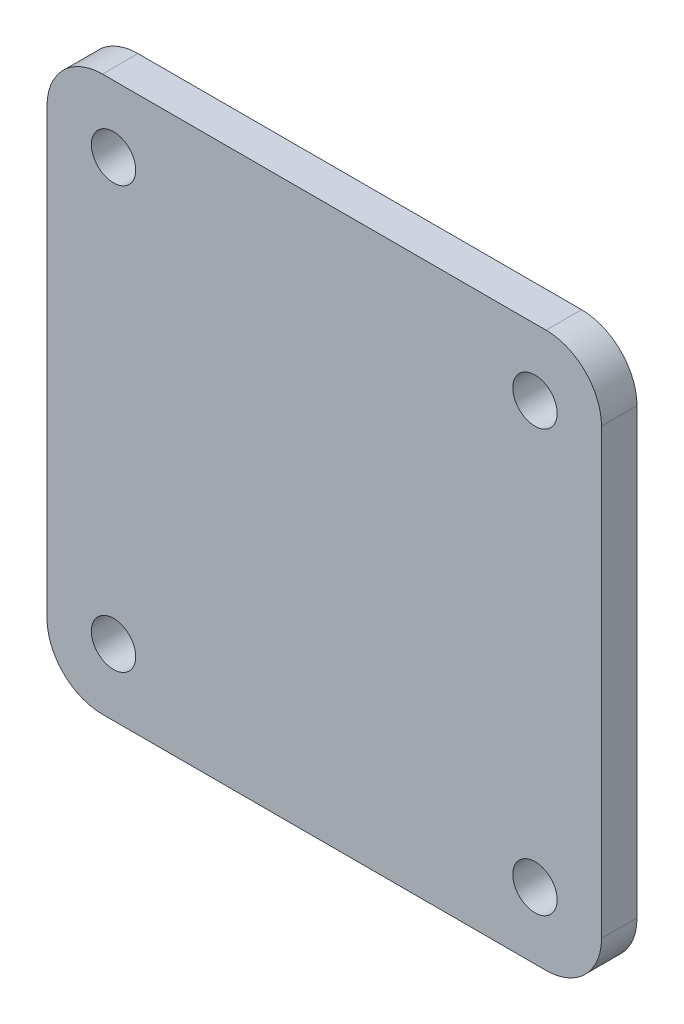
ISO-10303-21;
HEADER;
FILE_DESCRIPTION(('STEP AP214'),'2;1');
FILE_NAME('part.step','',(''),(''),'','','');
FILE_SCHEMA(('AUTOMOTIVE_DESIGN { 1 0 10303 214 1 1 1 1 }'));
ENDSEC;
DATA;
#1=APPLICATION_CONTEXT('core data for automotive mechanical design processes');
#2=APPLICATION_PROTOCOL_DEFINITION('international standard','automotive_design',2000,#1);
#3=PRODUCT_CONTEXT('',#1,'mechanical');
#4=PRODUCT('Part','Part','',(#3));
#5=PRODUCT_RELATED_PRODUCT_CATEGORY('part','',(#4));
#6=PRODUCT_DEFINITION_FORMATION('','',#4);
#7=PRODUCT_DEFINITION_CONTEXT('part definition',#1,'design');
#8=PRODUCT_DEFINITION('design','',#6,#7);
#9=PRODUCT_DEFINITION_SHAPE('','',#8);
#10=(LENGTH_UNIT() NAMED_UNIT(*) SI_UNIT(.MILLI.,.METRE.));
#11=(NAMED_UNIT(*) PLANE_ANGLE_UNIT() SI_UNIT($,.RADIAN.));
#12=(NAMED_UNIT(*) SI_UNIT($,.STERADIAN.) SOLID_ANGLE_UNIT());
#13=UNCERTAINTY_MEASURE_WITH_UNIT(LENGTH_MEASURE(1.E-05),#10,'distance_accuracy_value','');
#14=(GEOMETRIC_REPRESENTATION_CONTEXT(3) GLOBAL_UNCERTAINTY_ASSIGNED_CONTEXT((#13)) GLOBAL_UNIT_ASSIGNED_CONTEXT((#10,
#11,#12)) REPRESENTATION_CONTEXT('',''));
#15=CARTESIAN_POINT('',(0.,0.,0.));
#16=DIRECTION('',(0.,0.,1.));
#17=DIRECTION('',(1.,0.,0.));
#18=AXIS2_PLACEMENT_3D('',#15,#16,#17);
#19=CARTESIAN_POINT('',(0.,0.,1.6));
#20=DIRECTION('',(0.,0.,1.));
#21=DIRECTION('',(1.,0.,0.));
#22=AXIS2_PLACEMENT_3D('',#19,#20,#21);
#23=PLANE('',#22);
#24=CARTESIAN_POINT('',(9.50000000000001,-9.5,1.6));
#25=DIRECTION('',(0.,0.,1.));
#26=DIRECTION('',(1.,0.,0.));
#27=AXIS2_PLACEMENT_3D('',#24,#25,#26);
#28=CIRCLE('',#27,1.);
#29=CARTESIAN_POINT('',(10.5,-9.5,1.6));
#30=VERTEX_POINT('',#29);
#31=EDGE_CURVE('E189',#30,#30,#28,.T.);
#32=ORIENTED_EDGE('',*,*,#31,.F.);
#33=EDGE_LOOP('',(#32));
#34=FACE_BOUND('',#33,.T.);
#35=CARTESIAN_POINT('',(-9.50000000000001,9.5,1.6));
#36=DIRECTION('',(0.,0.,1.));
#37=DIRECTION('',(1.,0.,0.));
#38=AXIS2_PLACEMENT_3D('',#35,#36,#37);
#39=CIRCLE('',#38,1.);
#40=CARTESIAN_POINT('',(-8.5,9.5,1.6));
#41=VERTEX_POINT('',#40);
#42=EDGE_CURVE('E175',#41,#41,#39,.T.);
#43=ORIENTED_EDGE('',*,*,#42,.F.);
#44=EDGE_LOOP('',(#43));
#45=FACE_BOUND('',#44,.T.);
#46=DIRECTION('',(-1.,0.,0.));
#47=VECTOR('',#46,1.);
#48=CARTESIAN_POINT('',(-12.5,12.5,1.6));
#49=LINE('',#48,#47);
#50=CARTESIAN_POINT('',(10.,12.5,1.6));
#51=VERTEX_POINT('',#50);
#52=CARTESIAN_POINT('',(-10.,12.5,1.6));
#53=VERTEX_POINT('',#52);
#54=EDGE_CURVE('E170',#51,#53,#49,.T.);
#55=ORIENTED_EDGE('',*,*,#54,.T.);
#56=CARTESIAN_POINT('',(-10.,10.,1.6));
#57=DIRECTION('',(0.,0.,1.));
#58=DIRECTION('',(1.,0.,0.));
#59=AXIS2_PLACEMENT_3D('',#56,#57,#58);
#60=CIRCLE('',#59,2.5);
#61=CARTESIAN_POINT('',(-12.5,10.,1.6));
#62=VERTEX_POINT('',#61);
#63=EDGE_CURVE('E151',#53,#62,#60,.T.);
#64=ORIENTED_EDGE('',*,*,#63,.T.);
#65=DIRECTION('',(0.,-1.,0.));
#66=VECTOR('',#65,1.);
#67=CARTESIAN_POINT('',(-12.5,12.5,1.6));
#68=LINE('',#67,#66);
#69=CARTESIAN_POINT('',(-12.5,-10.,1.6));
#70=VERTEX_POINT('',#69);
#71=EDGE_CURVE('E121',#62,#70,#68,.T.);
#72=ORIENTED_EDGE('',*,*,#71,.T.);
#73=CARTESIAN_POINT('',(-10.,-10.,1.6));
#74=DIRECTION('',(0.,0.,1.));
#75=DIRECTION('',(1.,0.,0.));
#76=AXIS2_PLACEMENT_3D('',#73,#74,#75);
#77=CIRCLE('',#76,2.5);
#78=CARTESIAN_POINT('',(-10.,-12.5,1.6));
#79=VERTEX_POINT('',#78);
#80=EDGE_CURVE('E57',#70,#79,#77,.T.);
#81=ORIENTED_EDGE('',*,*,#80,.T.);
#82=DIRECTION('',(1.,0.,0.));
#83=VECTOR('',#82,1.);
#84=CARTESIAN_POINT('',(-12.5,-12.5,1.6));
#85=LINE('',#84,#83);
#86=CARTESIAN_POINT('',(10.,-12.5,1.6));
#87=VERTEX_POINT('',#86);
#88=EDGE_CURVE('E137',#79,#87,#85,.T.);
#89=ORIENTED_EDGE('',*,*,#88,.T.);
#90=CARTESIAN_POINT('',(10.,-10.,1.6));
#91=DIRECTION('',(0.,0.,1.));
#92=DIRECTION('',(1.,0.,0.));
#93=AXIS2_PLACEMENT_3D('',#90,#91,#92);
#94=CIRCLE('',#93,2.5);
#95=CARTESIAN_POINT('',(12.5,-10.,1.6));
#96=VERTEX_POINT('',#95);
#97=EDGE_CURVE('E148',#87,#96,#94,.T.);
#98=ORIENTED_EDGE('',*,*,#97,.T.);
#99=DIRECTION('',(0.,1.,0.));
#100=VECTOR('',#99,1.);
#101=CARTESIAN_POINT('',(12.5,12.5,1.6));
#102=LINE('',#101,#100);
#103=CARTESIAN_POINT('',(12.5,10.,1.6));
#104=VERTEX_POINT('',#103);
#105=EDGE_CURVE('E131',#96,#104,#102,.T.);
#106=ORIENTED_EDGE('',*,*,#105,.T.);
#107=CARTESIAN_POINT('',(10.,10.,1.6));
#108=DIRECTION('',(0.,0.,1.));
#109=DIRECTION('',(1.,0.,0.));
#110=AXIS2_PLACEMENT_3D('',#107,#108,#109);
#111=CIRCLE('',#110,2.5);
#112=EDGE_CURVE('E146',#104,#51,#111,.T.);
#113=ORIENTED_EDGE('',*,*,#112,.T.);
#114=EDGE_LOOP('',(#55,#64,#72,#81,#89,#98,#106,#113));
#115=FACE_BOUND('',#114,.T.);
#116=CARTESIAN_POINT('',(9.50000000000001,9.5,1.6));
#117=DIRECTION('',(0.,0.,1.));
#118=DIRECTION('',(-1.,0.,0.));
#119=AXIS2_PLACEMENT_3D('',#116,#117,#118);
#120=CIRCLE('',#119,1.);
#121=CARTESIAN_POINT('',(8.5,9.5,1.6));
#122=VERTEX_POINT('',#121);
#123=EDGE_CURVE('E184',#122,#122,#120,.T.);
#124=ORIENTED_EDGE('',*,*,#123,.F.);
#125=EDGE_LOOP('',(#124));
#126=FACE_BOUND('',#125,.T.);
#127=CARTESIAN_POINT('',(-9.50000000000001,-9.5,1.6));
#128=DIRECTION('',(0.,0.,1.));
#129=DIRECTION('',(-1.,0.,0.));
#130=AXIS2_PLACEMENT_3D('',#127,#128,#129);
#131=CIRCLE('',#130,1.);
#132=CARTESIAN_POINT('',(-10.5,-9.5,1.6));
#133=VERTEX_POINT('',#132);
#134=EDGE_CURVE('E195',#133,#133,#131,.T.);
#135=ORIENTED_EDGE('',*,*,#134,.F.);
#136=EDGE_LOOP('',(#135));
#137=FACE_BOUND('',#136,.T.);
#138=ADVANCED_FACE('F35',(#34,#45,#115,#126,#137),#23,.T.);
#139=CARTESIAN_POINT('',(0.,0.,0.));
#140=DIRECTION('',(0.,0.,1.));
#141=DIRECTION('',(1.,0.,0.));
#142=AXIS2_PLACEMENT_3D('',#139,#140,#141);
#143=PLANE('',#142);
#144=DIRECTION('',(0.,-1.,0.));
#145=VECTOR('',#144,1.);
#146=CARTESIAN_POINT('',(-12.5,12.5,0.));
#147=LINE('',#146,#145);
#148=CARTESIAN_POINT('',(-12.5,10.,0.));
#149=VERTEX_POINT('',#148);
#150=CARTESIAN_POINT('',(-12.5,-10.,0.));
#151=VERTEX_POINT('',#150);
#152=EDGE_CURVE('E119',#149,#151,#147,.T.);
#153=ORIENTED_EDGE('',*,*,#152,.F.);
#154=CARTESIAN_POINT('',(-10.,10.,0.));
#155=DIRECTION('',(0.,0.,1.));
#156=DIRECTION('',(1.,0.,0.));
#157=AXIS2_PLACEMENT_3D('',#154,#155,#156);
#158=CIRCLE('',#157,2.5);
#159=CARTESIAN_POINT('',(-10.,12.5,0.));
#160=VERTEX_POINT('',#159);
#161=EDGE_CURVE('E102',#149,#160,#158,.F.);
#162=ORIENTED_EDGE('',*,*,#161,.T.);
#163=DIRECTION('',(-1.,0.,0.));
#164=VECTOR('',#163,1.);
#165=CARTESIAN_POINT('',(-12.5,12.5,0.));
#166=LINE('',#165,#164);
#167=CARTESIAN_POINT('',(10.,12.5,0.));
#168=VERTEX_POINT('',#167);
#169=EDGE_CURVE('E129',#168,#160,#166,.T.);
#170=ORIENTED_EDGE('',*,*,#169,.F.);
#171=CARTESIAN_POINT('',(10.,10.,0.));
#172=DIRECTION('',(0.,0.,1.));
#173=DIRECTION('',(1.,0.,0.));
#174=AXIS2_PLACEMENT_3D('',#171,#172,#173);
#175=CIRCLE('',#174,2.5);
#176=CARTESIAN_POINT('',(12.5,10.,0.));
#177=VERTEX_POINT('',#176);
#178=EDGE_CURVE('E122',#168,#177,#175,.F.);
#179=ORIENTED_EDGE('',*,*,#178,.T.);
#180=DIRECTION('',(0.,1.,0.));
#181=VECTOR('',#180,1.);
#182=CARTESIAN_POINT('',(12.5,12.5,0.));
#183=LINE('',#182,#181);
#184=CARTESIAN_POINT('',(12.5,-10.,0.));
#185=VERTEX_POINT('',#184);
#186=EDGE_CURVE('E133',#185,#177,#183,.T.);
#187=ORIENTED_EDGE('',*,*,#186,.F.);
#188=CARTESIAN_POINT('',(10.,-10.,0.));
#189=DIRECTION('',(0.,0.,1.));
#190=DIRECTION('',(1.,0.,0.));
#191=AXIS2_PLACEMENT_3D('',#188,#189,#190);
#192=CIRCLE('',#191,2.5);
#193=CARTESIAN_POINT('',(10.,-12.5,0.));
#194=VERTEX_POINT('',#193);
#195=EDGE_CURVE('E140',#185,#194,#192,.F.);
#196=ORIENTED_EDGE('',*,*,#195,.T.);
#197=DIRECTION('',(1.,0.,0.));
#198=VECTOR('',#197,1.);
#199=CARTESIAN_POINT('',(-12.5,-12.5,0.));
#200=LINE('',#199,#198);
#201=CARTESIAN_POINT('',(-10.,-12.5,0.));
#202=VERTEX_POINT('',#201);
#203=EDGE_CURVE('E128',#202,#194,#200,.T.);
#204=ORIENTED_EDGE('',*,*,#203,.F.);
#205=CARTESIAN_POINT('',(-10.,-10.,0.));
#206=DIRECTION('',(0.,0.,1.));
#207=DIRECTION('',(1.,0.,0.));
#208=AXIS2_PLACEMENT_3D('',#205,#206,#207);
#209=CIRCLE('',#208,2.5);
#210=EDGE_CURVE('E113',#202,#151,#209,.F.);
#211=ORIENTED_EDGE('',*,*,#210,.T.);
#212=EDGE_LOOP('',(#153,#162,#170,#179,#187,#196,#204,#211));
#213=FACE_BOUND('',#212,.T.);
#214=CARTESIAN_POINT('',(-9.50000000000001,9.5,0.));
#215=DIRECTION('',(0.,0.,1.));
#216=DIRECTION('',(1.,0.,0.));
#217=AXIS2_PLACEMENT_3D('',#214,#215,#216);
#218=CIRCLE('',#217,1.);
#219=CARTESIAN_POINT('',(-8.5,9.5,0.));
#220=VERTEX_POINT('',#219);
#221=EDGE_CURVE('E177',#220,#220,#218,.T.);
#222=ORIENTED_EDGE('',*,*,#221,.T.);
#223=EDGE_LOOP('',(#222));
#224=FACE_BOUND('',#223,.T.);
#225=CARTESIAN_POINT('',(9.50000000000001,9.5,0.));
#226=DIRECTION('',(0.,0.,1.));
#227=DIRECTION('',(-1.,0.,0.));
#228=AXIS2_PLACEMENT_3D('',#225,#226,#227);
#229=CIRCLE('',#228,1.);
#230=CARTESIAN_POINT('',(8.5,9.5,0.));
#231=VERTEX_POINT('',#230);
#232=EDGE_CURVE('E186',#231,#231,#229,.T.);
#233=ORIENTED_EDGE('',*,*,#232,.T.);
#234=EDGE_LOOP('',(#233));
#235=FACE_BOUND('',#234,.T.);
#236=CARTESIAN_POINT('',(9.50000000000001,-9.5,0.));
#237=DIRECTION('',(0.,0.,1.));
#238=DIRECTION('',(1.,0.,0.));
#239=AXIS2_PLACEMENT_3D('',#236,#237,#238);
#240=CIRCLE('',#239,1.);
#241=CARTESIAN_POINT('',(10.5,-9.5,0.));
#242=VERTEX_POINT('',#241);
#243=EDGE_CURVE('E192',#242,#242,#240,.T.);
#244=ORIENTED_EDGE('',*,*,#243,.T.);
#245=EDGE_LOOP('',(#244));
#246=FACE_BOUND('',#245,.T.);
#247=CARTESIAN_POINT('',(-9.50000000000001,-9.5,0.));
#248=DIRECTION('',(0.,0.,1.));
#249=DIRECTION('',(-1.,0.,0.));
#250=AXIS2_PLACEMENT_3D('',#247,#248,#249);
#251=CIRCLE('',#250,1.);
#252=CARTESIAN_POINT('',(-10.5,-9.5,0.));
#253=VERTEX_POINT('',#252);
#254=EDGE_CURVE('E198',#253,#253,#251,.T.);
#255=ORIENTED_EDGE('',*,*,#254,.T.);
#256=EDGE_LOOP('',(#255));
#257=FACE_BOUND('',#256,.T.);
#258=ADVANCED_FACE('F125',(#213,#224,#235,#246,#257),#143,.F.);
#259=CARTESIAN_POINT('',(12.5,12.5,1.6));
#260=DIRECTION('',(-1.,0.,0.));
#261=DIRECTION('',(0.,0.,1.));
#262=AXIS2_PLACEMENT_3D('',#259,#260,#261);
#263=PLANE('',#262);
#264=ORIENTED_EDGE('',*,*,#105,.F.);
#265=DIRECTION('',(0.,0.,-1.));
#266=VECTOR('',#265,1.);
#267=CARTESIAN_POINT('',(12.5,-10.,1.6));
#268=LINE('',#267,#266);
#269=EDGE_CURVE('E11',#96,#185,#268,.T.);
#270=ORIENTED_EDGE('',*,*,#269,.T.);
#271=ORIENTED_EDGE('',*,*,#186,.T.);
#272=DIRECTION('',(0.,0.,-1.));
#273=VECTOR('',#272,1.);
#274=CARTESIAN_POINT('',(12.5,10.,1.6));
#275=LINE('',#274,#273);
#276=EDGE_CURVE('E43',#177,#104,#275,.F.);
#277=ORIENTED_EDGE('',*,*,#276,.T.);
#278=EDGE_LOOP('',(#264,#270,#271,#277));
#279=FACE_BOUND('',#278,.T.);
#280=ADVANCED_FACE('F161',(#279),#263,.F.);
#281=CARTESIAN_POINT('',(-12.5,12.5,1.6));
#282=DIRECTION('',(0.,-1.,0.));
#283=DIRECTION('',(0.,0.,-1.));
#284=AXIS2_PLACEMENT_3D('',#281,#282,#283);
#285=PLANE('',#284);
#286=ORIENTED_EDGE('',*,*,#169,.T.);
#287=DIRECTION('',(0.,0.,-1.));
#288=VECTOR('',#287,1.);
#289=CARTESIAN_POINT('',(-10.,12.5,1.6));
#290=LINE('',#289,#288);
#291=EDGE_CURVE('E107',#160,#53,#290,.F.);
#292=ORIENTED_EDGE('',*,*,#291,.T.);
#293=ORIENTED_EDGE('',*,*,#54,.F.);
#294=DIRECTION('',(0.,0.,-1.));
#295=VECTOR('',#294,1.);
#296=CARTESIAN_POINT('',(10.,12.5,1.6));
#297=LINE('',#296,#295);
#298=EDGE_CURVE('E112',#51,#168,#297,.T.);
#299=ORIENTED_EDGE('',*,*,#298,.T.);
#300=EDGE_LOOP('',(#286,#292,#293,#299));
#301=FACE_BOUND('',#300,.T.);
#302=ADVANCED_FACE('F174',(#301),#285,.F.);
#303=CARTESIAN_POINT('',(-12.5,12.5,1.6));
#304=DIRECTION('',(1.,0.,0.));
#305=DIRECTION('',(0.,0.,-1.));
#306=AXIS2_PLACEMENT_3D('',#303,#304,#305);
#307=PLANE('',#306);
#308=ORIENTED_EDGE('',*,*,#71,.F.);
#309=DIRECTION('',(0.,0.,-1.));
#310=VECTOR('',#309,1.);
#311=CARTESIAN_POINT('',(-12.5,10.,1.6));
#312=LINE('',#311,#310);
#313=EDGE_CURVE('E106',#62,#149,#312,.T.);
#314=ORIENTED_EDGE('',*,*,#313,.T.);
#315=ORIENTED_EDGE('',*,*,#152,.T.);
#316=DIRECTION('',(0.,0.,-1.));
#317=VECTOR('',#316,1.);
#318=CARTESIAN_POINT('',(-12.5,-10.,1.6));
#319=LINE('',#318,#317);
#320=EDGE_CURVE('E123',#151,#70,#319,.F.);
#321=ORIENTED_EDGE('',*,*,#320,.T.);
#322=EDGE_LOOP('',(#308,#314,#315,#321));
#323=FACE_BOUND('',#322,.T.);
#324=ADVANCED_FACE('F118',(#323),#307,.F.);
#325=CARTESIAN_POINT('',(-12.5,-12.5,1.6));
#326=DIRECTION('',(0.,1.,0.));
#327=DIRECTION('',(0.,0.,1.));
#328=AXIS2_PLACEMENT_3D('',#325,#326,#327);
#329=PLANE('',#328);
#330=ORIENTED_EDGE('',*,*,#88,.F.);
#331=DIRECTION('',(0.,0.,-1.));
#332=VECTOR('',#331,1.);
#333=CARTESIAN_POINT('',(-10.,-12.5,1.6));
#334=LINE('',#333,#332);
#335=EDGE_CURVE('E154',#79,#202,#334,.T.);
#336=ORIENTED_EDGE('',*,*,#335,.T.);
#337=ORIENTED_EDGE('',*,*,#203,.T.);
#338=DIRECTION('',(0.,0.,-1.));
#339=VECTOR('',#338,1.);
#340=CARTESIAN_POINT('',(10.,-12.5,1.6));
#341=LINE('',#340,#339);
#342=EDGE_CURVE('E50',#194,#87,#341,.F.);
#343=ORIENTED_EDGE('',*,*,#342,.T.);
#344=EDGE_LOOP('',(#330,#336,#337,#343));
#345=FACE_BOUND('',#344,.T.);
#346=ADVANCED_FACE('F220',(#345),#329,.F.);
#347=CARTESIAN_POINT('',(-9.50000000000001,9.5,1.6));
#348=DIRECTION('',(0.,0.,-1.));
#349=DIRECTION('',(-1.,0.,0.));
#350=AXIS2_PLACEMENT_3D('',#347,#348,#349);
#351=CYLINDRICAL_SURFACE('',#350,1.);
#352=ORIENTED_EDGE('',*,*,#42,.T.);
#353=EDGE_LOOP('',(#352));
#354=FACE_BOUND('',#353,.T.);
#355=ORIENTED_EDGE('',*,*,#221,.F.);
#356=EDGE_LOOP('',(#355));
#357=FACE_BOUND('',#356,.T.);
#358=ADVANCED_FACE('F217',(#354,#357),#351,.F.);
#359=CARTESIAN_POINT('',(9.50000000000001,9.5,1.6));
#360=DIRECTION('',(0.,0.,-1.));
#361=DIRECTION('',(-1.,0.,0.));
#362=AXIS2_PLACEMENT_3D('',#359,#360,#361);
#363=CYLINDRICAL_SURFACE('',#362,1.);
#364=ORIENTED_EDGE('',*,*,#123,.T.);
#365=EDGE_LOOP('',(#364));
#366=FACE_BOUND('',#365,.T.);
#367=ORIENTED_EDGE('',*,*,#232,.F.);
#368=EDGE_LOOP('',(#367));
#369=FACE_BOUND('',#368,.T.);
#370=ADVANCED_FACE('F312',(#366,#369),#363,.F.);
#371=CARTESIAN_POINT('',(9.50000000000001,-9.5,1.6));
#372=DIRECTION('',(0.,0.,-1.));
#373=DIRECTION('',(-1.,0.,0.));
#374=AXIS2_PLACEMENT_3D('',#371,#372,#373);
#375=CYLINDRICAL_SURFACE('',#374,1.);
#376=ORIENTED_EDGE('',*,*,#31,.T.);
#377=EDGE_LOOP('',(#376));
#378=FACE_BOUND('',#377,.T.);
#379=ORIENTED_EDGE('',*,*,#243,.F.);
#380=EDGE_LOOP('',(#379));
#381=FACE_BOUND('',#380,.T.);
#382=ADVANCED_FACE('F303',(#378,#381),#375,.F.);
#383=CARTESIAN_POINT('',(-9.50000000000001,-9.5,1.6));
#384=DIRECTION('',(0.,0.,-1.));
#385=DIRECTION('',(-1.,0.,0.));
#386=AXIS2_PLACEMENT_3D('',#383,#384,#385);
#387=CYLINDRICAL_SURFACE('',#386,1.);
#388=ORIENTED_EDGE('',*,*,#134,.T.);
#389=EDGE_LOOP('',(#388));
#390=FACE_BOUND('',#389,.T.);
#391=ORIENTED_EDGE('',*,*,#254,.F.);
#392=EDGE_LOOP('',(#391));
#393=FACE_BOUND('',#392,.T.);
#394=ADVANCED_FACE('F204',(#390,#393),#387,.F.);
#395=CARTESIAN_POINT('',(-10.,10.,1.6));
#396=DIRECTION('',(0.,0.,-1.));
#397=DIRECTION('',(-1.,0.,0.));
#398=AXIS2_PLACEMENT_3D('',#395,#396,#397);
#399=CYLINDRICAL_SURFACE('',#398,2.5);
#400=ORIENTED_EDGE('',*,*,#63,.F.);
#401=ORIENTED_EDGE('',*,*,#291,.F.);
#402=ORIENTED_EDGE('',*,*,#161,.F.);
#403=ORIENTED_EDGE('',*,*,#313,.F.);
#404=EDGE_LOOP('',(#400,#401,#402,#403));
#405=FACE_BOUND('',#404,.T.);
#406=ADVANCED_FACE('F105',(#405),#399,.T.);
#407=CARTESIAN_POINT('',(-10.,-10.,1.6));
#408=DIRECTION('',(0.,0.,-1.));
#409=DIRECTION('',(-1.,0.,0.));
#410=AXIS2_PLACEMENT_3D('',#407,#408,#409);
#411=CYLINDRICAL_SURFACE('',#410,2.5);
#412=ORIENTED_EDGE('',*,*,#80,.F.);
#413=ORIENTED_EDGE('',*,*,#320,.F.);
#414=ORIENTED_EDGE('',*,*,#210,.F.);
#415=ORIENTED_EDGE('',*,*,#335,.F.);
#416=EDGE_LOOP('',(#412,#413,#414,#415));
#417=FACE_BOUND('',#416,.T.);
#418=ADVANCED_FACE('F231',(#417),#411,.T.);
#419=CARTESIAN_POINT('',(10.,-10.,1.6));
#420=DIRECTION('',(0.,0.,-1.));
#421=DIRECTION('',(-1.,0.,0.));
#422=AXIS2_PLACEMENT_3D('',#419,#420,#421);
#423=CYLINDRICAL_SURFACE('',#422,2.5);
#424=ORIENTED_EDGE('',*,*,#97,.F.);
#425=ORIENTED_EDGE('',*,*,#342,.F.);
#426=ORIENTED_EDGE('',*,*,#195,.F.);
#427=ORIENTED_EDGE('',*,*,#269,.F.);
#428=EDGE_LOOP('',(#424,#425,#426,#427));
#429=FACE_BOUND('',#428,.T.);
#430=ADVANCED_FACE('F233',(#429),#423,.T.);
#431=CARTESIAN_POINT('',(10.,10.,1.6));
#432=DIRECTION('',(0.,0.,-1.));
#433=DIRECTION('',(-1.,0.,0.));
#434=AXIS2_PLACEMENT_3D('',#431,#432,#433);
#435=CYLINDRICAL_SURFACE('',#434,2.5);
#436=ORIENTED_EDGE('',*,*,#112,.F.);
#437=ORIENTED_EDGE('',*,*,#276,.F.);
#438=ORIENTED_EDGE('',*,*,#178,.F.);
#439=ORIENTED_EDGE('',*,*,#298,.F.);
#440=EDGE_LOOP('',(#436,#437,#438,#439));
#441=FACE_BOUND('',#440,.T.);
#442=ADVANCED_FACE('F37',(#441),#435,.T.);
#443=CLOSED_SHELL('',(#138,#258,#280,#302,#324,#346,#358,#370,#382,#394,#406,#418,#430,#442));
#444=MANIFOLD_SOLID_BREP('B2',#443);
#445=ADVANCED_BREP_SHAPE_REPRESENTATION('',(#18,#444),#14);
#446=SHAPE_DEFINITION_REPRESENTATION(#9,#445);
ENDSEC;
END-ISO-10303-21;
